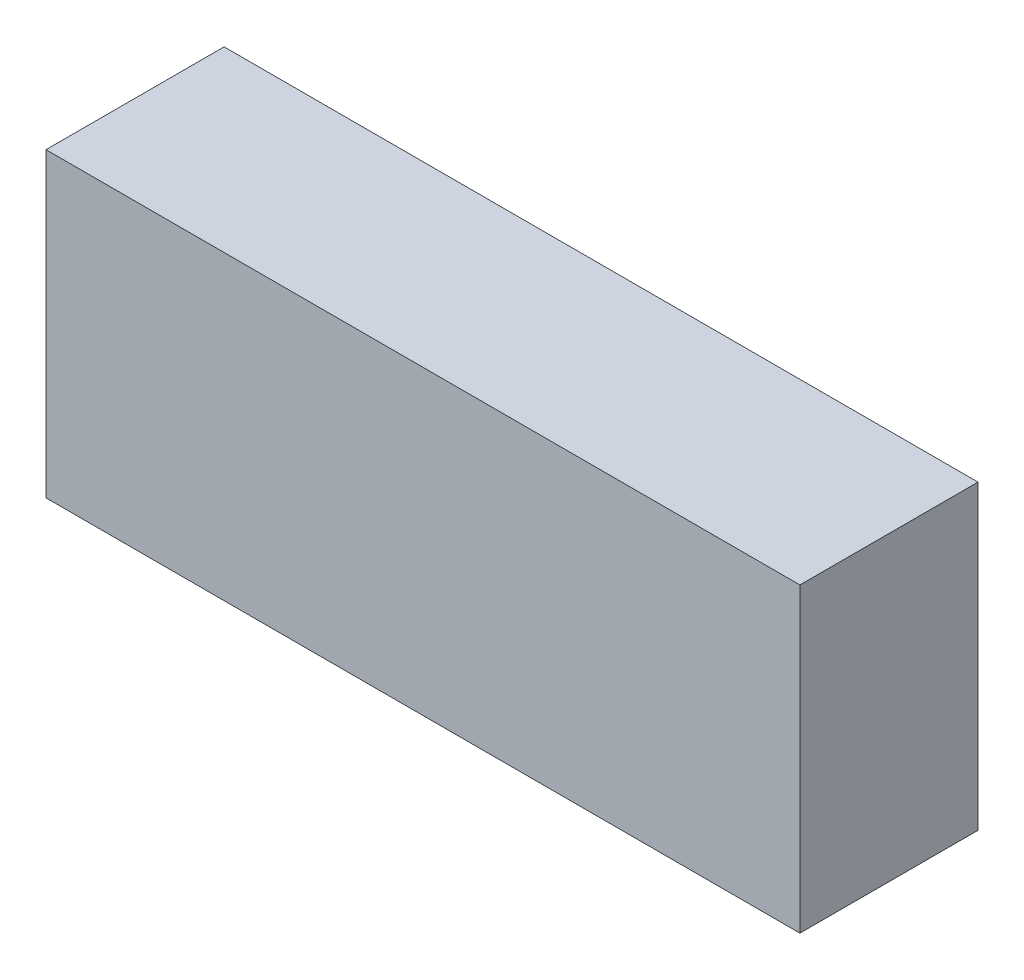
ISO-10303-21;
HEADER;
FILE_DESCRIPTION(('STEP AP214'),'2;1');
FILE_NAME('part.step','',(''),(''),'','','');
FILE_SCHEMA(('AUTOMOTIVE_DESIGN { 1 0 10303 214 1 1 1 1 }'));
ENDSEC;
DATA;
#1=APPLICATION_CONTEXT('core data for automotive mechanical design processes');
#2=APPLICATION_PROTOCOL_DEFINITION('international standard','automotive_design',2000,#1);
#3=PRODUCT_CONTEXT('',#1,'mechanical');
#4=PRODUCT('Part','Part','',(#3));
#5=PRODUCT_RELATED_PRODUCT_CATEGORY('part','',(#4));
#6=PRODUCT_DEFINITION_FORMATION('','',#4);
#7=PRODUCT_DEFINITION_CONTEXT('part definition',#1,'design');
#8=PRODUCT_DEFINITION('design','',#6,#7);
#9=PRODUCT_DEFINITION_SHAPE('','',#8);
#10=(LENGTH_UNIT() NAMED_UNIT(*) SI_UNIT(.MILLI.,.METRE.));
#11=(NAMED_UNIT(*) PLANE_ANGLE_UNIT() SI_UNIT($,.RADIAN.));
#12=(NAMED_UNIT(*) SI_UNIT($,.STERADIAN.) SOLID_ANGLE_UNIT());
#13=UNCERTAINTY_MEASURE_WITH_UNIT(LENGTH_MEASURE(1.E-05),#10,'distance_accuracy_value','');
#14=(GEOMETRIC_REPRESENTATION_CONTEXT(3) GLOBAL_UNCERTAINTY_ASSIGNED_CONTEXT((#13)) GLOBAL_UNIT_ASSIGNED_CONTEXT((#10,
#11,#12)) REPRESENTATION_CONTEXT('',''));
#15=CARTESIAN_POINT('',(0.,0.,0.));
#16=DIRECTION('',(0.,0.,1.));
#17=DIRECTION('',(1.,0.,0.));
#18=AXIS2_PLACEMENT_3D('',#15,#16,#17);
#19=CARTESIAN_POINT('',(11.43,3.81,5.));
#20=DIRECTION('',(0.,0.,-1.));
#21=DIRECTION('',(-1.,0.,0.));
#22=AXIS2_PLACEMENT_3D('',#19,#20,#21);
#23=PLANE('',#22);
#24=DIRECTION('',(0.,1.,0.));
#25=VECTOR('',#24,1.);
#26=CARTESIAN_POINT('',(-1.27,3.81,5.));
#27=LINE('',#26,#25);
#28=CARTESIAN_POINT('',(-1.27,3.81,5.));
#29=VERTEX_POINT('',#28);
#30=CARTESIAN_POINT('',(-1.27,-1.27,5.));
#31=VERTEX_POINT('',#30);
#32=EDGE_CURVE('E55',#29,#31,#27,.F.);
#33=ORIENTED_EDGE('',*,*,#32,.T.);
#34=DIRECTION('',(1.,0.,0.));
#35=VECTOR('',#34,1.);
#36=CARTESIAN_POINT('',(-1.27,-1.27,5.));
#37=LINE('',#36,#35);
#38=CARTESIAN_POINT('',(11.43,-1.27,5.));
#39=VERTEX_POINT('',#38);
#40=EDGE_CURVE('E57',#31,#39,#37,.T.);
#41=ORIENTED_EDGE('',*,*,#40,.T.);
#42=DIRECTION('',(0.,1.,0.));
#43=VECTOR('',#42,1.);
#44=CARTESIAN_POINT('',(11.43,-1.27,5.));
#45=LINE('',#44,#43);
#46=CARTESIAN_POINT('',(11.43,3.81,5.));
#47=VERTEX_POINT('',#46);
#48=EDGE_CURVE('E20',#39,#47,#45,.T.);
#49=ORIENTED_EDGE('',*,*,#48,.T.);
#50=DIRECTION('',(1.,0.,0.));
#51=VECTOR('',#50,1.);
#52=CARTESIAN_POINT('',(11.43,3.81,5.));
#53=LINE('',#52,#51);
#54=EDGE_CURVE('E80',#47,#29,#53,.F.);
#55=ORIENTED_EDGE('',*,*,#54,.T.);
#56=EDGE_LOOP('',(#33,#41,#49,#55));
#57=FACE_BOUND('',#56,.T.);
#58=ADVANCED_FACE('F17',(#57),#23,.F.);
#59=CARTESIAN_POINT('',(11.43,-1.27,2.));
#60=DIRECTION('',(-1.,0.,0.));
#61=DIRECTION('',(0.,0.,1.));
#62=AXIS2_PLACEMENT_3D('',#59,#60,#61);
#63=PLANE('',#62);
#64=DIRECTION('',(0.,0.,-1.));
#65=VECTOR('',#64,1.);
#66=CARTESIAN_POINT('',(11.43,3.81,2.));
#67=LINE('',#66,#65);
#68=CARTESIAN_POINT('',(11.43,3.81,2.));
#69=VERTEX_POINT('',#68);
#70=EDGE_CURVE('E68',#69,#47,#67,.F.);
#71=ORIENTED_EDGE('',*,*,#70,.T.);
#72=ORIENTED_EDGE('',*,*,#48,.F.);
#73=DIRECTION('',(0.,0.,1.));
#74=VECTOR('',#73,1.);
#75=CARTESIAN_POINT('',(11.43,-1.27,2.));
#76=LINE('',#75,#74);
#77=CARTESIAN_POINT('',(11.43,-1.27,2.));
#78=VERTEX_POINT('',#77);
#79=EDGE_CURVE('E63',#39,#78,#76,.F.);
#80=ORIENTED_EDGE('',*,*,#79,.T.);
#81=DIRECTION('',(0.,1.,0.));
#82=VECTOR('',#81,1.);
#83=CARTESIAN_POINT('',(11.43,3.81,2.));
#84=LINE('',#83,#82);
#85=EDGE_CURVE('E83',#69,#78,#84,.F.);
#86=ORIENTED_EDGE('',*,*,#85,.F.);
#87=EDGE_LOOP('',(#71,#72,#80,#86));
#88=FACE_BOUND('',#87,.T.);
#89=ADVANCED_FACE('F65',(#88),#63,.F.);
#90=CARTESIAN_POINT('',(-1.27,-1.27,2.));
#91=DIRECTION('',(0.,1.,0.));
#92=DIRECTION('',(0.,0.,1.));
#93=AXIS2_PLACEMENT_3D('',#90,#91,#92);
#94=PLANE('',#93);
#95=ORIENTED_EDGE('',*,*,#79,.F.);
#96=ORIENTED_EDGE('',*,*,#40,.F.);
#97=DIRECTION('',(0.,0.,-1.));
#98=VECTOR('',#97,1.);
#99=CARTESIAN_POINT('',(-1.27,-1.27,2.));
#100=LINE('',#99,#98);
#101=CARTESIAN_POINT('',(-1.27,-1.27,2.));
#102=VERTEX_POINT('',#101);
#103=EDGE_CURVE('E75',#31,#102,#100,.T.);
#104=ORIENTED_EDGE('',*,*,#103,.T.);
#105=DIRECTION('',(-1.,0.,0.));
#106=VECTOR('',#105,1.);
#107=CARTESIAN_POINT('',(11.43,-1.27,2.));
#108=LINE('',#107,#106);
#109=EDGE_CURVE('E72',#78,#102,#108,.T.);
#110=ORIENTED_EDGE('',*,*,#109,.F.);
#111=EDGE_LOOP('',(#95,#96,#104,#110));
#112=FACE_BOUND('',#111,.T.);
#113=ADVANCED_FACE('F70',(#112),#94,.F.);
#114=CARTESIAN_POINT('',(-1.27,3.81,2.));
#115=DIRECTION('',(1.,0.,0.));
#116=DIRECTION('',(0.,0.,-1.));
#117=AXIS2_PLACEMENT_3D('',#114,#115,#116);
#118=PLANE('',#117);
#119=ORIENTED_EDGE('',*,*,#103,.F.);
#120=ORIENTED_EDGE('',*,*,#32,.F.);
#121=DIRECTION('',(0.,0.,-1.));
#122=VECTOR('',#121,1.);
#123=CARTESIAN_POINT('',(-1.27,3.81,2.));
#124=LINE('',#123,#122);
#125=CARTESIAN_POINT('',(-1.27,3.81,2.));
#126=VERTEX_POINT('',#125);
#127=EDGE_CURVE('E35',#29,#126,#124,.T.);
#128=ORIENTED_EDGE('',*,*,#127,.T.);
#129=DIRECTION('',(0.,1.,0.));
#130=VECTOR('',#129,1.);
#131=CARTESIAN_POINT('',(-1.27,3.81,2.));
#132=LINE('',#131,#130);
#133=EDGE_CURVE('E26',#102,#126,#132,.T.);
#134=ORIENTED_EDGE('',*,*,#133,.F.);
#135=EDGE_LOOP('',(#119,#120,#128,#134));
#136=FACE_BOUND('',#135,.T.);
#137=ADVANCED_FACE('F89',(#136),#118,.F.);
#138=CARTESIAN_POINT('',(11.43,3.81,2.));
#139=DIRECTION('',(0.,-1.,0.));
#140=DIRECTION('',(0.,0.,-1.));
#141=AXIS2_PLACEMENT_3D('',#138,#139,#140);
#142=PLANE('',#141);
#143=ORIENTED_EDGE('',*,*,#127,.F.);
#144=ORIENTED_EDGE('',*,*,#54,.F.);
#145=ORIENTED_EDGE('',*,*,#70,.F.);
#146=DIRECTION('',(-1.,0.,0.));
#147=VECTOR('',#146,1.);
#148=CARTESIAN_POINT('',(11.43,3.81,2.));
#149=LINE('',#148,#147);
#150=EDGE_CURVE('E11',#126,#69,#149,.F.);
#151=ORIENTED_EDGE('',*,*,#150,.F.);
#152=EDGE_LOOP('',(#143,#144,#145,#151));
#153=FACE_BOUND('',#152,.T.);
#154=ADVANCED_FACE('F91',(#153),#142,.F.);
#155=CARTESIAN_POINT('',(11.43,3.81,2.));
#156=DIRECTION('',(0.,0.,-1.));
#157=DIRECTION('',(-1.,0.,0.));
#158=AXIS2_PLACEMENT_3D('',#155,#156,#157);
#159=PLANE('',#158);
#160=ORIENTED_EDGE('',*,*,#133,.T.);
#161=ORIENTED_EDGE('',*,*,#150,.T.);
#162=ORIENTED_EDGE('',*,*,#85,.T.);
#163=ORIENTED_EDGE('',*,*,#109,.T.);
#164=EDGE_LOOP('',(#160,#161,#162,#163));
#165=FACE_BOUND('',#164,.T.);
#166=ADVANCED_FACE('F88',(#165),#159,.T.);
#167=CLOSED_SHELL('',(#58,#89,#113,#137,#154,#166));
#168=MANIFOLD_SOLID_BREP('B1',#167);
#169=ADVANCED_BREP_SHAPE_REPRESENTATION('',(#18,#168),#14);
#170=SHAPE_DEFINITION_REPRESENTATION(#9,#169);
ENDSEC;
END-ISO-10303-21;
